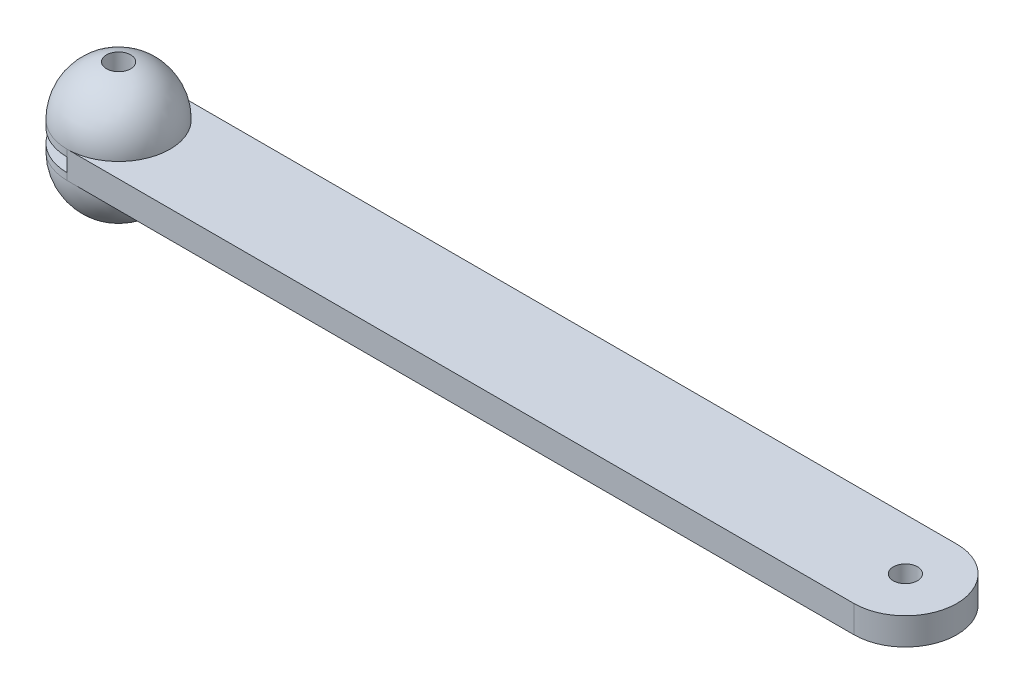
ISO-10303-21;
HEADER;
FILE_DESCRIPTION(('STEP AP214'),'2;1');
FILE_NAME('part.step','',(''),(''),'','','');
FILE_SCHEMA(('AUTOMOTIVE_DESIGN { 1 0 10303 214 1 1 1 1 }'));
ENDSEC;
DATA;
#1=APPLICATION_CONTEXT('core data for automotive mechanical design processes');
#2=APPLICATION_PROTOCOL_DEFINITION('international standard','automotive_design',2000,#1);
#3=PRODUCT_CONTEXT('',#1,'mechanical');
#4=PRODUCT('Part','Part','',(#3));
#5=PRODUCT_RELATED_PRODUCT_CATEGORY('part','',(#4));
#6=PRODUCT_DEFINITION_FORMATION('','',#4);
#7=PRODUCT_DEFINITION_CONTEXT('part definition',#1,'design');
#8=PRODUCT_DEFINITION('design','',#6,#7);
#9=PRODUCT_DEFINITION_SHAPE('','',#8);
#10=(LENGTH_UNIT() NAMED_UNIT(*) SI_UNIT(.MILLI.,.METRE.));
#11=(NAMED_UNIT(*) PLANE_ANGLE_UNIT() SI_UNIT($,.RADIAN.));
#12=(NAMED_UNIT(*) SI_UNIT($,.STERADIAN.) SOLID_ANGLE_UNIT());
#13=UNCERTAINTY_MEASURE_WITH_UNIT(LENGTH_MEASURE(1.E-05),#10,'distance_accuracy_value','');
#14=(GEOMETRIC_REPRESENTATION_CONTEXT(3) GLOBAL_UNCERTAINTY_ASSIGNED_CONTEXT((#13)) GLOBAL_UNIT_ASSIGNED_CONTEXT((#10,
#11,#12)) REPRESENTATION_CONTEXT('',''));
#15=CARTESIAN_POINT('',(0.,0.,0.));
#16=DIRECTION('',(0.,0.,1.));
#17=DIRECTION('',(1.,0.,0.));
#18=AXIS2_PLACEMENT_3D('',#15,#16,#17);
#19=CARTESIAN_POINT('',(-232.15,8.,0.));
#20=DIRECTION('',(0.,-1.,0.));
#21=DIRECTION('',(0.,0.,-1.));
#22=AXIS2_PLACEMENT_3D('',#19,#20,#21);
#23=CYLINDRICAL_SURFACE('',#22,30.35);
#24=CARTESIAN_POINT('',(-232.15,-4.,0.));
#25=DIRECTION('',(0.,1.,0.));
#26=DIRECTION('',(0.,0.,1.));
#27=AXIS2_PLACEMENT_3D('',#24,#25,#26);
#28=CIRCLE('',#27,30.35);
#29=CARTESIAN_POINT('',(-232.15,-4.,-30.35));
#30=VERTEX_POINT('',#29);
#31=CARTESIAN_POINT('',(-232.15,-4.,30.35));
#32=VERTEX_POINT('',#31);
#33=EDGE_CURVE('E118',#30,#32,#28,.T.);
#34=ORIENTED_EDGE('',*,*,#33,.F.);
#35=DIRECTION('',(0.,-1.,0.));
#36=VECTOR('',#35,1.);
#37=CARTESIAN_POINT('',(-232.15,8.,-30.35));
#38=LINE('',#37,#36);
#39=CARTESIAN_POINT('',(-232.15,-8.,-30.35));
#40=VERTEX_POINT('',#39);
#41=EDGE_CURVE('E82',#30,#40,#38,.T.);
#42=ORIENTED_EDGE('',*,*,#41,.T.);
#43=CARTESIAN_POINT('',(-232.15,-8.,0.));
#44=DIRECTION('',(0.,1.,0.));
#45=DIRECTION('',(0.,0.,1.));
#46=AXIS2_PLACEMENT_3D('',#43,#44,#45);
#47=CIRCLE('',#46,30.35);
#48=CARTESIAN_POINT('',(-232.15,-8.,30.35));
#49=VERTEX_POINT('',#48);
#50=EDGE_CURVE('E145',#40,#49,#47,.T.);
#51=ORIENTED_EDGE('',*,*,#50,.T.);
#52=DIRECTION('',(0.,-1.,0.));
#53=VECTOR('',#52,1.);
#54=CARTESIAN_POINT('',(-232.15,8.,30.35));
#55=LINE('',#54,#53);
#56=EDGE_CURVE('E48',#32,#49,#55,.T.);
#57=ORIENTED_EDGE('',*,*,#56,.F.);
#58=EDGE_LOOP('',(#34,#42,#51,#57));
#59=FACE_BOUND('',#58,.T.);
#60=ADVANCED_FACE('F38',(#59),#23,.T.);
#61=CARTESIAN_POINT('',(-232.15,8.,-30.35));
#62=VERTEX_POINT('',#61);
#63=CARTESIAN_POINT('',(-232.15,4.,-30.35));
#64=VERTEX_POINT('',#63);
#65=EDGE_CURVE('E124',#62,#64,#38,.T.);
#66=ORIENTED_EDGE('',*,*,#65,.T.);
#67=CARTESIAN_POINT('',(-232.15,4.,0.));
#68=DIRECTION('',(0.,1.,0.));
#69=DIRECTION('',(0.,0.,1.));
#70=AXIS2_PLACEMENT_3D('',#67,#68,#69);
#71=CIRCLE('',#70,30.35);
#72=CARTESIAN_POINT('',(-232.15,4.,30.35));
#73=VERTEX_POINT('',#72);
#74=EDGE_CURVE('E115',#64,#73,#71,.T.);
#75=ORIENTED_EDGE('',*,*,#74,.T.);
#76=CARTESIAN_POINT('',(-232.15,8.,30.35));
#77=VERTEX_POINT('',#76);
#78=EDGE_CURVE('E11',#77,#73,#55,.T.);
#79=ORIENTED_EDGE('',*,*,#78,.F.);
#80=CARTESIAN_POINT('',(-232.15,8.,0.));
#81=DIRECTION('',(0.,1.,0.));
#82=DIRECTION('',(0.,0.,1.));
#83=AXIS2_PLACEMENT_3D('',#80,#81,#82);
#84=CIRCLE('',#83,30.35);
#85=EDGE_CURVE('E88',#62,#77,#84,.T.);
#86=ORIENTED_EDGE('',*,*,#85,.F.);
#87=EDGE_LOOP('',(#66,#75,#79,#86));
#88=FACE_BOUND('',#87,.T.);
#89=ADVANCED_FACE('F40',(#88),#23,.T.);
#90=CARTESIAN_POINT('',(-232.15,8.,30.35));
#91=DIRECTION('',(0.,0.,-1.));
#92=DIRECTION('',(-1.,0.,0.));
#93=AXIS2_PLACEMENT_3D('',#90,#91,#92);
#94=PLANE('',#93);
#95=DIRECTION('',(1.,0.,0.));
#96=VECTOR('',#95,1.);
#97=CARTESIAN_POINT('',(-232.15,-8.,30.35));
#98=LINE('',#97,#96);
#99=CARTESIAN_POINT('',(232.15,-8.,30.35));
#100=VERTEX_POINT('',#99);
#101=EDGE_CURVE('E148',#49,#100,#98,.T.);
#102=ORIENTED_EDGE('',*,*,#101,.T.);
#103=DIRECTION('',(0.,-1.,0.));
#104=VECTOR('',#103,1.);
#105=CARTESIAN_POINT('',(232.15,8.,30.35));
#106=LINE('',#105,#104);
#107=CARTESIAN_POINT('',(232.15,8.,30.35));
#108=VERTEX_POINT('',#107);
#109=EDGE_CURVE('E132',#108,#100,#106,.T.);
#110=ORIENTED_EDGE('',*,*,#109,.F.);
#111=DIRECTION('',(1.,0.,0.));
#112=VECTOR('',#111,1.);
#113=CARTESIAN_POINT('',(-232.15,8.,30.35));
#114=LINE('',#113,#112);
#115=EDGE_CURVE('E130',#77,#108,#114,.T.);
#116=ORIENTED_EDGE('',*,*,#115,.F.);
#117=ORIENTED_EDGE('',*,*,#78,.T.);
#118=DIRECTION('',(0.,1.,0.));
#119=VECTOR('',#118,1.);
#120=CARTESIAN_POINT('',(-232.15,-4.,30.35));
#121=LINE('',#120,#119);
#122=EDGE_CURVE('E103',#32,#73,#121,.T.);
#123=ORIENTED_EDGE('',*,*,#122,.F.);
#124=ORIENTED_EDGE('',*,*,#56,.T.);
#125=EDGE_LOOP('',(#102,#110,#116,#117,#123,#124));
#126=FACE_BOUND('',#125,.T.);
#127=ADVANCED_FACE('F128',(#126),#94,.F.);
#128=CARTESIAN_POINT('',(232.15,8.,0.));
#129=DIRECTION('',(0.,-1.,0.));
#130=DIRECTION('',(0.,0.,-1.));
#131=AXIS2_PLACEMENT_3D('',#128,#129,#130);
#132=CYLINDRICAL_SURFACE('',#131,30.35);
#133=CARTESIAN_POINT('',(232.15,-8.,0.));
#134=DIRECTION('',(0.,1.,0.));
#135=DIRECTION('',(0.,0.,1.));
#136=AXIS2_PLACEMENT_3D('',#133,#134,#135);
#137=CIRCLE('',#136,30.35);
#138=CARTESIAN_POINT('',(232.15,-8.,-30.35));
#139=VERTEX_POINT('',#138);
#140=EDGE_CURVE('E152',#100,#139,#137,.T.);
#141=ORIENTED_EDGE('',*,*,#140,.T.);
#142=DIRECTION('',(0.,-1.,0.));
#143=VECTOR('',#142,1.);
#144=CARTESIAN_POINT('',(232.15,8.,-30.35));
#145=LINE('',#144,#143);
#146=CARTESIAN_POINT('',(232.15,8.,-30.35));
#147=VERTEX_POINT('',#146);
#148=EDGE_CURVE('E160',#147,#139,#145,.T.);
#149=ORIENTED_EDGE('',*,*,#148,.F.);
#150=CARTESIAN_POINT('',(232.15,8.,0.));
#151=DIRECTION('',(0.,1.,0.));
#152=DIRECTION('',(0.,0.,1.));
#153=AXIS2_PLACEMENT_3D('',#150,#151,#152);
#154=CIRCLE('',#153,30.35);
#155=EDGE_CURVE('E64',#108,#147,#154,.T.);
#156=ORIENTED_EDGE('',*,*,#155,.F.);
#157=ORIENTED_EDGE('',*,*,#109,.T.);
#158=EDGE_LOOP('',(#141,#149,#156,#157));
#159=FACE_BOUND('',#158,.T.);
#160=ADVANCED_FACE('F251',(#159),#132,.T.);
#161=CARTESIAN_POINT('',(-232.15,8.,-30.35));
#162=DIRECTION('',(0.,0.,1.));
#163=DIRECTION('',(1.,0.,0.));
#164=AXIS2_PLACEMENT_3D('',#161,#162,#163);
#165=PLANE('',#164);
#166=DIRECTION('',(-1.,0.,0.));
#167=VECTOR('',#166,1.);
#168=CARTESIAN_POINT('',(-232.15,-8.,-30.35));
#169=LINE('',#168,#167);
#170=EDGE_CURVE('E139',#139,#40,#169,.T.);
#171=ORIENTED_EDGE('',*,*,#170,.T.);
#172=ORIENTED_EDGE('',*,*,#41,.F.);
#173=EDGE_CURVE('E161',#64,#30,#38,.T.);
#174=ORIENTED_EDGE('',*,*,#173,.F.);
#175=ORIENTED_EDGE('',*,*,#65,.F.);
#176=DIRECTION('',(-1.,0.,0.));
#177=VECTOR('',#176,1.);
#178=CARTESIAN_POINT('',(-232.15,8.,-30.35));
#179=LINE('',#178,#177);
#180=EDGE_CURVE('E137',#147,#62,#179,.T.);
#181=ORIENTED_EDGE('',*,*,#180,.F.);
#182=ORIENTED_EDGE('',*,*,#148,.T.);
#183=EDGE_LOOP('',(#171,#172,#174,#175,#181,#182));
#184=FACE_BOUND('',#183,.T.);
#185=ADVANCED_FACE('F195',(#184),#165,.F.);
#186=CARTESIAN_POINT('',(-232.15,8.,0.));
#187=DIRECTION('',(0.,1.,0.));
#188=DIRECTION('',(0.,0.,1.));
#189=AXIS2_PLACEMENT_3D('',#186,#187,#188);
#190=PLANE('',#189);
#191=CARTESIAN_POINT('',(232.15,8.,0.));
#192=DIRECTION('',(0.,1.,0.));
#193=DIRECTION('',(0.,0.,1.));
#194=AXIS2_PLACEMENT_3D('',#191,#192,#193);
#195=CIRCLE('',#194,7.14999999999998);
#196=CARTESIAN_POINT('',(232.15,8.,7.14999999999998));
#197=VERTEX_POINT('',#196);
#198=EDGE_CURVE('E182',#197,#197,#195,.T.);
#199=ORIENTED_EDGE('',*,*,#198,.F.);
#200=EDGE_LOOP('',(#199));
#201=FACE_BOUND('',#200,.T.);
#202=ORIENTED_EDGE('',*,*,#180,.T.);
#203=CARTESIAN_POINT('',(-232.15,8.,0.));
#204=DIRECTION('',(0.,-1.,0.));
#205=DIRECTION('',(0.,0.,-1.));
#206=AXIS2_PLACEMENT_3D('',#203,#204,#205);
#207=CIRCLE('',#206,30.35);
#208=EDGE_CURVE('E179',#62,#77,#207,.T.);
#209=ORIENTED_EDGE('',*,*,#208,.T.);
#210=ORIENTED_EDGE('',*,*,#115,.T.);
#211=ORIENTED_EDGE('',*,*,#155,.T.);
#212=EDGE_LOOP('',(#202,#209,#210,#211));
#213=FACE_BOUND('',#212,.T.);
#214=ADVANCED_FACE('F193',(#201,#213),#190,.T.);
#215=CARTESIAN_POINT('',(-232.15,-8.,0.));
#216=DIRECTION('',(0.,1.,0.));
#217=DIRECTION('',(0.,0.,1.));
#218=AXIS2_PLACEMENT_3D('',#215,#216,#217);
#219=PLANE('',#218);
#220=CARTESIAN_POINT('',(-232.15,-8.,0.));
#221=DIRECTION('',(0.,-1.,0.));
#222=DIRECTION('',(0.,0.,-1.));
#223=AXIS2_PLACEMENT_3D('',#220,#221,#222);
#224=CIRCLE('',#223,30.35);
#225=EDGE_CURVE('E110',#40,#49,#224,.T.);
#226=ORIENTED_EDGE('',*,*,#225,.F.);
#227=ORIENTED_EDGE('',*,*,#170,.F.);
#228=ORIENTED_EDGE('',*,*,#140,.F.);
#229=ORIENTED_EDGE('',*,*,#101,.F.);
#230=EDGE_LOOP('',(#226,#227,#228,#229));
#231=FACE_BOUND('',#230,.T.);
#232=CARTESIAN_POINT('',(232.15,-8.,0.));
#233=DIRECTION('',(0.,1.,0.));
#234=DIRECTION('',(0.,0.,1.));
#235=AXIS2_PLACEMENT_3D('',#232,#233,#234);
#236=CIRCLE('',#235,7.14999999999998);
#237=CARTESIAN_POINT('',(232.15,-8.,7.14999999999998));
#238=VERTEX_POINT('',#237);
#239=EDGE_CURVE('E149',#238,#238,#236,.T.);
#240=ORIENTED_EDGE('',*,*,#239,.T.);
#241=EDGE_LOOP('',(#240));
#242=FACE_BOUND('',#241,.T.);
#243=ADVANCED_FACE('F174',(#231,#242),#219,.F.);
#244=CARTESIAN_POINT('',(232.15,-8.,0.));
#245=DIRECTION('',(0.,1.,0.));
#246=DIRECTION('',(0.,0.,1.));
#247=AXIS2_PLACEMENT_3D('',#244,#245,#246);
#248=CYLINDRICAL_SURFACE('',#247,7.14999999999998);
#249=ORIENTED_EDGE('',*,*,#239,.F.);
#250=EDGE_LOOP('',(#249));
#251=FACE_BOUND('',#250,.T.);
#252=ORIENTED_EDGE('',*,*,#198,.T.);
#253=EDGE_LOOP('',(#252));
#254=FACE_BOUND('',#253,.T.);
#255=ADVANCED_FACE('F191',(#251,#254),#248,.F.);
#256=CARTESIAN_POINT('',(-232.15,8.,0.));
#257=DIRECTION('',(0.,0.,1.));
#258=DIRECTION('',(1.,0.,0.));
#259=AXIS2_PLACEMENT_3D('',#256,#257,#258);
#260=SPHERICAL_SURFACE('',#259,30.35);
#261=CARTESIAN_POINT('',(-232.15,8.,0.));
#262=DIRECTION('',(0.,-1.,0.));
#263=DIRECTION('',(0.,0.,-1.));
#264=AXIS2_PLACEMENT_3D('',#261,#262,#263);
#265=SPHERICAL_SURFACE('',#264,30.35);
#266=CARTESIAN_POINT('',(-232.15,37.4957624075053,0.));
#267=DIRECTION('',(0.,-1.,0.));
#268=DIRECTION('',(0.,0.,-1.));
#269=AXIS2_PLACEMENT_3D('',#266,#267,#268);
#270=CIRCLE('',#269,7.14999999999998);
#271=CARTESIAN_POINT('',(-232.15,37.4957624075053,-7.14999999999998));
#272=VERTEX_POINT('',#271);
#273=EDGE_CURVE('E126',#272,#272,#270,.T.);
#274=ORIENTED_EDGE('',*,*,#273,.T.);
#275=EDGE_LOOP('',(#274));
#276=FACE_BOUND('',#275,.T.);
#277=ORIENTED_EDGE('',*,*,#208,.F.);
#278=ORIENTED_EDGE('',*,*,#85,.T.);
#279=EDGE_LOOP('',(#277,#278));
#280=FACE_BOUND('',#279,.T.);
#281=ADVANCED_FACE('F231',(#276,#280),#265,.T.);
#282=CARTESIAN_POINT('',(-232.15,-8.,0.));
#283=DIRECTION('',(0.,0.,1.));
#284=DIRECTION('',(1.,0.,0.));
#285=AXIS2_PLACEMENT_3D('',#282,#283,#284);
#286=SPHERICAL_SURFACE('',#285,30.35);
#287=CARTESIAN_POINT('',(-232.15,-8.,0.));
#288=DIRECTION('',(0.,1.,0.));
#289=DIRECTION('',(0.,0.,1.));
#290=AXIS2_PLACEMENT_3D('',#287,#288,#289);
#291=SPHERICAL_SURFACE('',#290,30.35);
#292=CARTESIAN_POINT('',(-232.15,-37.4957624075053,0.));
#293=DIRECTION('',(0.,1.,0.));
#294=DIRECTION('',(0.,0.,1.));
#295=AXIS2_PLACEMENT_3D('',#292,#293,#294);
#296=CIRCLE('',#295,7.14999999999998);
#297=CARTESIAN_POINT('',(-232.15,-37.4957624075053,7.14999999999998));
#298=VERTEX_POINT('',#297);
#299=EDGE_CURVE('E210',#298,#298,#296,.T.);
#300=ORIENTED_EDGE('',*,*,#299,.T.);
#301=EDGE_LOOP('',(#300));
#302=FACE_BOUND('',#301,.T.);
#303=ORIENTED_EDGE('',*,*,#225,.T.);
#304=ORIENTED_EDGE('',*,*,#50,.F.);
#305=EDGE_LOOP('',(#303,#304));
#306=FACE_BOUND('',#305,.T.);
#307=ADVANCED_FACE('F177',(#302,#306),#291,.T.);
#308=CARTESIAN_POINT('',(-232.15,-4.,0.));
#309=DIRECTION('',(0.,1.,0.));
#310=DIRECTION('',(0.,0.,1.));
#311=AXIS2_PLACEMENT_3D('',#308,#309,#310);
#312=CYLINDRICAL_SURFACE('',#311,30.35);
#313=ORIENTED_EDGE('',*,*,#122,.T.);
#314=EDGE_CURVE('E55',#73,#64,#71,.T.);
#315=ORIENTED_EDGE('',*,*,#314,.T.);
#316=ORIENTED_EDGE('',*,*,#173,.T.);
#317=EDGE_CURVE('E106',#32,#30,#28,.T.);
#318=ORIENTED_EDGE('',*,*,#317,.F.);
#319=EDGE_LOOP('',(#313,#315,#316,#318));
#320=FACE_BOUND('',#319,.T.);
#321=ADVANCED_FACE('F104',(#320),#312,.F.);
#322=CARTESIAN_POINT('',(-232.15,-4.,0.));
#323=DIRECTION('',(0.,1.,0.));
#324=DIRECTION('',(0.,0.,1.));
#325=AXIS2_PLACEMENT_3D('',#322,#323,#324);
#326=PLANE('',#325);
#327=CARTESIAN_POINT('',(-232.15,-4.,0.));
#328=DIRECTION('',(0.,1.,0.));
#329=DIRECTION('',(0.,0.,1.));
#330=AXIS2_PLACEMENT_3D('',#327,#328,#329);
#331=CIRCLE('',#330,7.14999999999998);
#332=CARTESIAN_POINT('',(-232.15,-4.,7.14999999999998));
#333=VERTEX_POINT('',#332);
#334=EDGE_CURVE('E214',#333,#333,#331,.T.);
#335=ORIENTED_EDGE('',*,*,#334,.F.);
#336=EDGE_LOOP('',(#335));
#337=FACE_BOUND('',#336,.T.);
#338=ORIENTED_EDGE('',*,*,#317,.T.);
#339=ORIENTED_EDGE('',*,*,#33,.T.);
#340=EDGE_LOOP('',(#338,#339));
#341=FACE_BOUND('',#340,.T.);
#342=ADVANCED_FACE('F202',(#337,#341),#326,.T.);
#343=CARTESIAN_POINT('',(-232.15,4.,0.));
#344=DIRECTION('',(0.,1.,0.));
#345=DIRECTION('',(0.,0.,1.));
#346=AXIS2_PLACEMENT_3D('',#343,#344,#345);
#347=PLANE('',#346);
#348=CARTESIAN_POINT('',(-232.15,4.,0.));
#349=DIRECTION('',(0.,1.,0.));
#350=DIRECTION('',(0.,0.,1.));
#351=AXIS2_PLACEMENT_3D('',#348,#349,#350);
#352=CIRCLE('',#351,7.14999999999998);
#353=CARTESIAN_POINT('',(-232.15,4.,7.14999999999998));
#354=VERTEX_POINT('',#353);
#355=EDGE_CURVE('E42',#354,#354,#352,.T.);
#356=ORIENTED_EDGE('',*,*,#355,.T.);
#357=EDGE_LOOP('',(#356));
#358=FACE_BOUND('',#357,.T.);
#359=ORIENTED_EDGE('',*,*,#314,.F.);
#360=ORIENTED_EDGE('',*,*,#74,.F.);
#361=EDGE_LOOP('',(#359,#360));
#362=FACE_BOUND('',#361,.T.);
#363=ADVANCED_FACE('F114',(#358,#362),#347,.F.);
#364=CARTESIAN_POINT('',(-232.15,-38.35,0.));
#365=DIRECTION('',(0.,1.,0.));
#366=DIRECTION('',(0.,0.,1.));
#367=AXIS2_PLACEMENT_3D('',#364,#365,#366);
#368=CYLINDRICAL_SURFACE('',#367,7.14999999999998);
#369=ORIENTED_EDGE('',*,*,#355,.F.);
#370=EDGE_LOOP('',(#369));
#371=FACE_BOUND('',#370,.T.);
#372=ORIENTED_EDGE('',*,*,#273,.F.);
#373=EDGE_LOOP('',(#372));
#374=FACE_BOUND('',#373,.T.);
#375=ADVANCED_FACE('F224',(#371,#374),#368,.F.);
#376=ORIENTED_EDGE('',*,*,#334,.T.);
#377=EDGE_LOOP('',(#376));
#378=FACE_BOUND('',#377,.T.);
#379=ORIENTED_EDGE('',*,*,#299,.F.);
#380=EDGE_LOOP('',(#379));
#381=FACE_BOUND('',#380,.T.);
#382=ADVANCED_FACE('F227',(#378,#381),#368,.F.);
#383=CLOSED_SHELL('',(#60,#89,#127,#160,#185,#214,#243,#255,#281,#307,#321,#342,#363,#375,#382));
#384=MANIFOLD_SOLID_BREP('B2',#383);
#385=ADVANCED_BREP_SHAPE_REPRESENTATION('',(#18,#384),#14);
#386=SHAPE_DEFINITION_REPRESENTATION(#9,#385);
ENDSEC;
END-ISO-10303-21;
